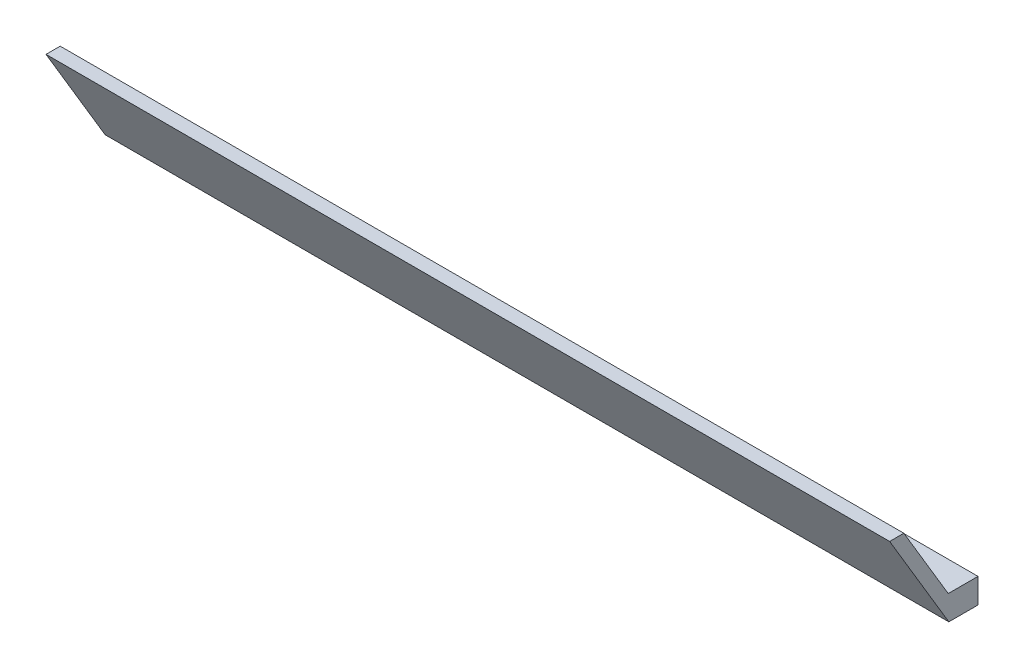
ISO-10303-21;
HEADER;
FILE_DESCRIPTION(('STEP AP214'),'2;1');
FILE_NAME('part.step','',(''),(''),'','','');
FILE_SCHEMA(('AUTOMOTIVE_DESIGN { 1 0 10303 214 1 1 1 1 }'));
ENDSEC;
DATA;
#1=APPLICATION_CONTEXT('core data for automotive mechanical design processes');
#2=APPLICATION_PROTOCOL_DEFINITION('international standard','automotive_design',2000,#1);
#3=PRODUCT_CONTEXT('',#1,'mechanical');
#4=PRODUCT('Part','Part','',(#3));
#5=PRODUCT_RELATED_PRODUCT_CATEGORY('part','',(#4));
#6=PRODUCT_DEFINITION_FORMATION('','',#4);
#7=PRODUCT_DEFINITION_CONTEXT('part definition',#1,'design');
#8=PRODUCT_DEFINITION('design','',#6,#7);
#9=PRODUCT_DEFINITION_SHAPE('','',#8);
#10=(LENGTH_UNIT() NAMED_UNIT(*) SI_UNIT(.MILLI.,.METRE.));
#11=(NAMED_UNIT(*) PLANE_ANGLE_UNIT() SI_UNIT($,.RADIAN.));
#12=(NAMED_UNIT(*) SI_UNIT($,.STERADIAN.) SOLID_ANGLE_UNIT());
#13=UNCERTAINTY_MEASURE_WITH_UNIT(LENGTH_MEASURE(1.E-05),#10,'distance_accuracy_value','');
#14=(GEOMETRIC_REPRESENTATION_CONTEXT(3) GLOBAL_UNCERTAINTY_ASSIGNED_CONTEXT((#13)) GLOBAL_UNIT_ASSIGNED_CONTEXT((#10,
#11,#12)) REPRESENTATION_CONTEXT('',''));
#15=CARTESIAN_POINT('',(0.,0.,0.));
#16=DIRECTION('',(0.,0.,1.));
#17=DIRECTION('',(1.,0.,0.));
#18=AXIS2_PLACEMENT_3D('',#15,#16,#17);
#19=CARTESIAN_POINT('',(85.,15.,8.94414005055203));
#20=DIRECTION('',(0.,-0.512141949842736,0.858900822686345));
#21=DIRECTION('',(0.,-0.858900822686345,-0.512141949842736));
#22=AXIS2_PLACEMENT_3D('',#19,#20,#21);
#23=PLANE('',#22);
#24=DIRECTION('',(0.,0.858900822686345,0.512141949842736));
#25=VECTOR('',#24,1.);
#26=CARTESIAN_POINT('',(-85.,15.,8.94414005055203));
#27=LINE('',#26,#25);
#28=CARTESIAN_POINT('',(-85.,0.,0.));
#29=VERTEX_POINT('',#28);
#30=CARTESIAN_POINT('',(-85.,15.,8.94414005055203));
#31=VERTEX_POINT('',#30);
#32=EDGE_CURVE('E125',#29,#31,#27,.T.);
#33=ORIENTED_EDGE('',*,*,#32,.T.);
#34=DIRECTION('',(-1.,0.,0.));
#35=VECTOR('',#34,1.);
#36=CARTESIAN_POINT('',(85.,15.,8.94414005055203));
#37=LINE('',#36,#35);
#38=CARTESIAN_POINT('',(85.,15.,8.94414005055203));
#39=VERTEX_POINT('',#38);
#40=EDGE_CURVE('E11',#39,#31,#37,.T.);
#41=ORIENTED_EDGE('',*,*,#40,.F.);
#42=DIRECTION('',(0.,0.858900822686345,0.512141949842736));
#43=VECTOR('',#42,1.);
#44=CARTESIAN_POINT('',(85.,15.,8.94414005055203));
#45=LINE('',#44,#43);
#46=CARTESIAN_POINT('',(85.,0.,0.));
#47=VERTEX_POINT('',#46);
#48=EDGE_CURVE('E135',#47,#39,#45,.T.);
#49=ORIENTED_EDGE('',*,*,#48,.F.);
#50=DIRECTION('',(-1.,0.,0.));
#51=VECTOR('',#50,1.);
#52=CARTESIAN_POINT('',(85.,0.,0.));
#53=LINE('',#52,#51);
#54=EDGE_CURVE('E121',#47,#29,#53,.T.);
#55=ORIENTED_EDGE('',*,*,#54,.T.);
#56=EDGE_LOOP('',(#33,#41,#49,#55));
#57=FACE_BOUND('',#56,.T.);
#58=ADVANCED_FACE('F41',(#57),#23,.F.);
#59=CARTESIAN_POINT('',(85.,15.,11.8053165798678));
#60=DIRECTION('',(0.,-1.,0.));
#61=DIRECTION('',(0.,0.,-1.));
#62=AXIS2_PLACEMENT_3D('',#59,#60,#61);
#63=PLANE('',#62);
#64=DIRECTION('',(0.,0.,1.));
#65=VECTOR('',#64,1.);
#66=CARTESIAN_POINT('',(-85.,15.,11.8053165798678));
#67=LINE('',#66,#65);
#68=CARTESIAN_POINT('',(-85.,15.,11.8053165798678));
#69=VERTEX_POINT('',#68);
#70=EDGE_CURVE('E128',#31,#69,#67,.T.);
#71=ORIENTED_EDGE('',*,*,#70,.T.);
#72=DIRECTION('',(-1.,0.,0.));
#73=VECTOR('',#72,1.);
#74=CARTESIAN_POINT('',(85.,15.,11.8053165798678));
#75=LINE('',#74,#73);
#76=CARTESIAN_POINT('',(85.,15.,11.8053165798678));
#77=VERTEX_POINT('',#76);
#78=EDGE_CURVE('E49',#77,#69,#75,.T.);
#79=ORIENTED_EDGE('',*,*,#78,.F.);
#80=DIRECTION('',(0.,0.,1.));
#81=VECTOR('',#80,1.);
#82=CARTESIAN_POINT('',(85.,15.,11.8053165798678));
#83=LINE('',#82,#81);
#84=EDGE_CURVE('E94',#39,#77,#83,.T.);
#85=ORIENTED_EDGE('',*,*,#84,.F.);
#86=ORIENTED_EDGE('',*,*,#40,.T.);
#87=EDGE_LOOP('',(#71,#79,#85,#86));
#88=FACE_BOUND('',#87,.T.);
#89=ADVANCED_FACE('F159',(#88),#63,.F.);
#90=CARTESIAN_POINT('',(85.,-5.,-0.120203487534956));
#91=DIRECTION('',(0.,0.512141949842736,-0.858900822686345));
#92=DIRECTION('',(0.,0.858900822686345,0.512141949842736));
#93=AXIS2_PLACEMENT_3D('',#90,#91,#92);
#94=PLANE('',#93);
#95=DIRECTION('',(0.,-0.858900822686345,-0.512141949842736));
#96=VECTOR('',#95,1.);
#97=CARTESIAN_POINT('',(-85.,-5.,-0.120203487534956));
#98=LINE('',#97,#96);
#99=CARTESIAN_POINT('',(-85.,-5.,-0.120203487534956));
#100=VERTEX_POINT('',#99);
#101=EDGE_CURVE('E130',#69,#100,#98,.T.);
#102=ORIENTED_EDGE('',*,*,#101,.T.);
#103=DIRECTION('',(-1.,0.,0.));
#104=VECTOR('',#103,1.);
#105=CARTESIAN_POINT('',(85.,-5.,-0.120203487534956));
#106=LINE('',#105,#104);
#107=CARTESIAN_POINT('',(85.,-5.,-0.120203487534956));
#108=VERTEX_POINT('',#107);
#109=EDGE_CURVE('E116',#108,#100,#106,.T.);
#110=ORIENTED_EDGE('',*,*,#109,.F.);
#111=DIRECTION('',(0.,-0.858900822686345,-0.512141949842736));
#112=VECTOR('',#111,1.);
#113=CARTESIAN_POINT('',(85.,-5.,-0.120203487534956));
#114=LINE('',#113,#112);
#115=EDGE_CURVE('E107',#77,#108,#114,.T.);
#116=ORIENTED_EDGE('',*,*,#115,.F.);
#117=ORIENTED_EDGE('',*,*,#78,.T.);
#118=EDGE_LOOP('',(#102,#110,#116,#117));
#119=FACE_BOUND('',#118,.T.);
#120=ADVANCED_FACE('F141',(#119),#94,.F.);
#121=CARTESIAN_POINT('',(85.,-5.,-6.));
#122=DIRECTION('',(0.,1.,0.));
#123=DIRECTION('',(0.,0.,1.));
#124=AXIS2_PLACEMENT_3D('',#121,#122,#123);
#125=PLANE('',#124);
#126=DIRECTION('',(0.,0.,-1.));
#127=VECTOR('',#126,1.);
#128=CARTESIAN_POINT('',(-85.,-5.,-6.));
#129=LINE('',#128,#127);
#130=CARTESIAN_POINT('',(-85.,-5.,-6.));
#131=VERTEX_POINT('',#130);
#132=EDGE_CURVE('E115',#100,#131,#129,.T.);
#133=ORIENTED_EDGE('',*,*,#132,.T.);
#134=DIRECTION('',(-1.,0.,0.));
#135=VECTOR('',#134,1.);
#136=CARTESIAN_POINT('',(85.,-5.,-6.));
#137=LINE('',#136,#135);
#138=CARTESIAN_POINT('',(85.,-5.,-6.));
#139=VERTEX_POINT('',#138);
#140=EDGE_CURVE('E112',#139,#131,#137,.T.);
#141=ORIENTED_EDGE('',*,*,#140,.F.);
#142=DIRECTION('',(0.,0.,-1.));
#143=VECTOR('',#142,1.);
#144=CARTESIAN_POINT('',(85.,-5.,-6.));
#145=LINE('',#144,#143);
#146=EDGE_CURVE('E101',#108,#139,#145,.T.);
#147=ORIENTED_EDGE('',*,*,#146,.F.);
#148=ORIENTED_EDGE('',*,*,#109,.T.);
#149=EDGE_LOOP('',(#133,#141,#147,#148));
#150=FACE_BOUND('',#149,.T.);
#151=ADVANCED_FACE('F113',(#150),#125,.F.);
#152=CARTESIAN_POINT('',(85.,0.,-6.));
#153=DIRECTION('',(0.,0.,1.));
#154=DIRECTION('',(0.,-1.,0.));
#155=AXIS2_PLACEMENT_3D('',#152,#153,#154);
#156=PLANE('',#155);
#157=DIRECTION('',(0.,1.,0.));
#158=VECTOR('',#157,1.);
#159=CARTESIAN_POINT('',(-85.,0.,-6.));
#160=LINE('',#159,#158);
#161=CARTESIAN_POINT('',(-85.,0.,-6.));
#162=VERTEX_POINT('',#161);
#163=EDGE_CURVE('E80',#131,#162,#160,.T.);
#164=ORIENTED_EDGE('',*,*,#163,.T.);
#165=DIRECTION('',(-1.,0.,0.));
#166=VECTOR('',#165,1.);
#167=CARTESIAN_POINT('',(85.,0.,-6.));
#168=LINE('',#167,#166);
#169=CARTESIAN_POINT('',(85.,0.,-6.));
#170=VERTEX_POINT('',#169);
#171=EDGE_CURVE('E117',#170,#162,#168,.T.);
#172=ORIENTED_EDGE('',*,*,#171,.F.);
#173=DIRECTION('',(0.,1.,0.));
#174=VECTOR('',#173,1.);
#175=CARTESIAN_POINT('',(85.,0.,-6.));
#176=LINE('',#175,#174);
#177=EDGE_CURVE('E105',#139,#170,#176,.T.);
#178=ORIENTED_EDGE('',*,*,#177,.F.);
#179=ORIENTED_EDGE('',*,*,#140,.T.);
#180=EDGE_LOOP('',(#164,#172,#178,#179));
#181=FACE_BOUND('',#180,.T.);
#182=ADVANCED_FACE('F119',(#181),#156,.F.);
#183=CARTESIAN_POINT('',(85.,0.,0.));
#184=DIRECTION('',(0.,-1.,0.));
#185=DIRECTION('',(0.,0.,-1.));
#186=AXIS2_PLACEMENT_3D('',#183,#184,#185);
#187=PLANE('',#186);
#188=DIRECTION('',(0.,0.,1.));
#189=VECTOR('',#188,1.);
#190=CARTESIAN_POINT('',(-85.,0.,0.));
#191=LINE('',#190,#189);
#192=EDGE_CURVE('E86',#162,#29,#191,.T.);
#193=ORIENTED_EDGE('',*,*,#192,.T.);
#194=ORIENTED_EDGE('',*,*,#54,.F.);
#195=DIRECTION('',(0.,0.,1.));
#196=VECTOR('',#195,1.);
#197=CARTESIAN_POINT('',(85.,0.,0.));
#198=LINE('',#197,#196);
#199=EDGE_CURVE('E57',#170,#47,#198,.T.);
#200=ORIENTED_EDGE('',*,*,#199,.F.);
#201=ORIENTED_EDGE('',*,*,#171,.T.);
#202=EDGE_LOOP('',(#193,#194,#200,#201));
#203=FACE_BOUND('',#202,.T.);
#204=ADVANCED_FACE('F148',(#203),#187,.F.);
#205=CARTESIAN_POINT('',(85.,0.,0.));
#206=DIRECTION('',(1.,0.,0.));
#207=DIRECTION('',(0.,0.,-1.));
#208=AXIS2_PLACEMENT_3D('',#205,#206,#207);
#209=PLANE('',#208);
#210=ORIENTED_EDGE('',*,*,#48,.T.);
#211=ORIENTED_EDGE('',*,*,#84,.T.);
#212=ORIENTED_EDGE('',*,*,#115,.T.);
#213=ORIENTED_EDGE('',*,*,#146,.T.);
#214=ORIENTED_EDGE('',*,*,#177,.T.);
#215=ORIENTED_EDGE('',*,*,#199,.T.);
#216=EDGE_LOOP('',(#210,#211,#212,#213,#214,#215));
#217=FACE_BOUND('',#216,.T.);
#218=ADVANCED_FACE('F103',(#217),#209,.T.);
#219=CARTESIAN_POINT('',(-85.,0.,0.));
#220=DIRECTION('',(1.,0.,0.));
#221=DIRECTION('',(0.,0.,-1.));
#222=AXIS2_PLACEMENT_3D('',#219,#220,#221);
#223=PLANE('',#222);
#224=ORIENTED_EDGE('',*,*,#32,.F.);
#225=ORIENTED_EDGE('',*,*,#192,.F.);
#226=ORIENTED_EDGE('',*,*,#163,.F.);
#227=ORIENTED_EDGE('',*,*,#132,.F.);
#228=ORIENTED_EDGE('',*,*,#101,.F.);
#229=ORIENTED_EDGE('',*,*,#70,.F.);
#230=EDGE_LOOP('',(#224,#225,#226,#227,#228,#229));
#231=FACE_BOUND('',#230,.T.);
#232=ADVANCED_FACE('F144',(#231),#223,.F.);
#233=CLOSED_SHELL('',(#58,#89,#120,#151,#182,#204,#218,#232));
#234=MANIFOLD_SOLID_BREP('B2',#233);
#235=ADVANCED_BREP_SHAPE_REPRESENTATION('',(#18,#234),#14);
#236=SHAPE_DEFINITION_REPRESENTATION(#9,#235);
ENDSEC;
END-ISO-10303-21;
